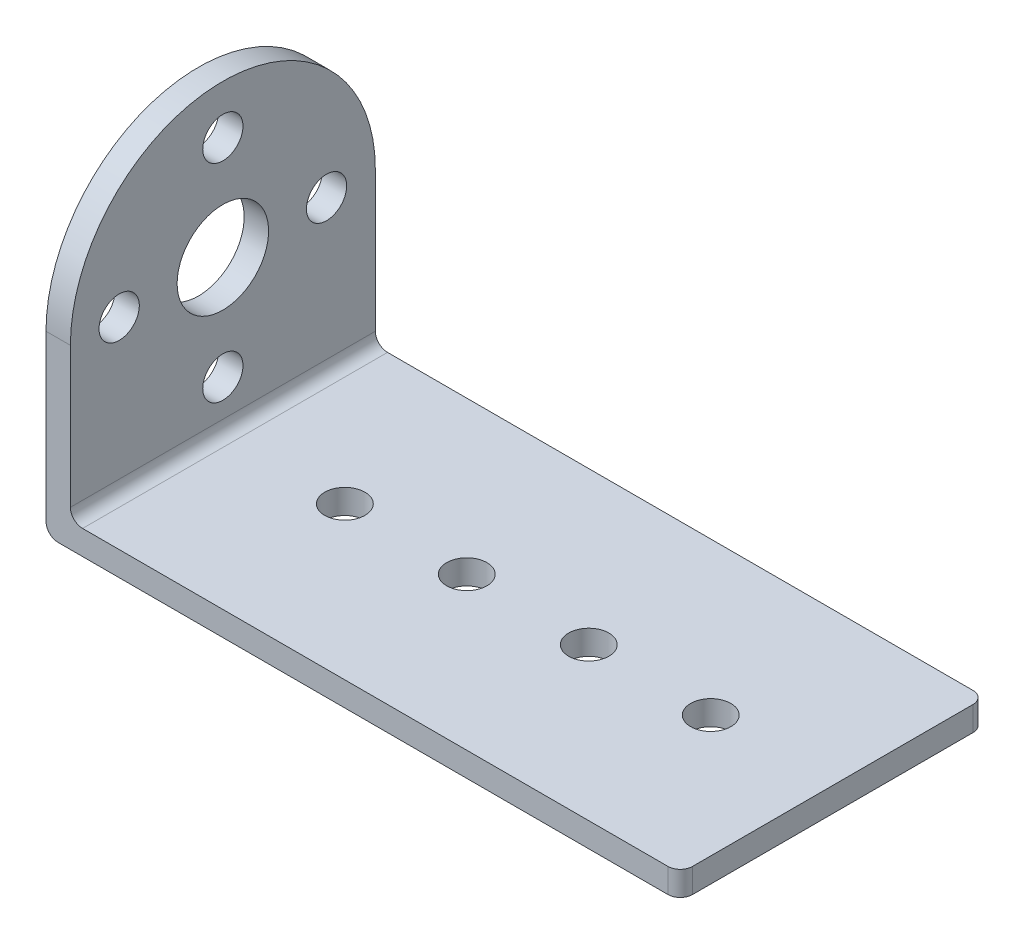
ISO-10303-21;
HEADER;
FILE_DESCRIPTION(('STEP AP214'),'2;1');
FILE_NAME('part.step','',(''),(''),'','','');
FILE_SCHEMA(('AUTOMOTIVE_DESIGN { 1 0 10303 214 1 1 1 1 }'));
ENDSEC;
DATA;
#1=APPLICATION_CONTEXT('core data for automotive mechanical design processes');
#2=APPLICATION_PROTOCOL_DEFINITION('international standard','automotive_design',2000,#1);
#3=PRODUCT_CONTEXT('',#1,'mechanical');
#4=PRODUCT('Part','Part','',(#3));
#5=PRODUCT_RELATED_PRODUCT_CATEGORY('part','',(#4));
#6=PRODUCT_DEFINITION_FORMATION('','',#4);
#7=PRODUCT_DEFINITION_CONTEXT('part definition',#1,'design');
#8=PRODUCT_DEFINITION('design','',#6,#7);
#9=PRODUCT_DEFINITION_SHAPE('','',#8);
#10=(LENGTH_UNIT() NAMED_UNIT(*) SI_UNIT(.MILLI.,.METRE.));
#11=(NAMED_UNIT(*) PLANE_ANGLE_UNIT() SI_UNIT($,.RADIAN.));
#12=(NAMED_UNIT(*) SI_UNIT($,.STERADIAN.) SOLID_ANGLE_UNIT());
#13=UNCERTAINTY_MEASURE_WITH_UNIT(LENGTH_MEASURE(1.E-05),#10,'distance_accuracy_value','');
#14=(GEOMETRIC_REPRESENTATION_CONTEXT(3) GLOBAL_UNCERTAINTY_ASSIGNED_CONTEXT((#13)) GLOBAL_UNIT_ASSIGNED_CONTEXT((#10,
#11,#12)) REPRESENTATION_CONTEXT('',''));
#15=CARTESIAN_POINT('',(0.,0.,0.));
#16=DIRECTION('',(0.,0.,1.));
#17=DIRECTION('',(1.,0.,0.));
#18=AXIS2_PLACEMENT_3D('',#15,#16,#17);
#19=CARTESIAN_POINT('',(0.,2.,0.));
#20=DIRECTION('',(1.,0.,0.));
#21=DIRECTION('',(0.,0.,-1.));
#22=AXIS2_PLACEMENT_3D('',#19,#20,#21);
#23=PLANE('',#22);
#24=CARTESIAN_POINT('',(0.,23.,-12.5));
#25=DIRECTION('',(-1.,0.,0.));
#26=DIRECTION('',(0.,0.,1.));
#27=AXIS2_PLACEMENT_3D('',#24,#25,#26);
#28=CIRCLE('',#27,1.65);
#29=CARTESIAN_POINT('',(0.,23.,-10.85));
#30=VERTEX_POINT('',#29);
#31=EDGE_CURVE('E301',#30,#30,#28,.T.);
#32=ORIENTED_EDGE('',*,*,#31,.F.);
#33=EDGE_LOOP('',(#32));
#34=FACE_BOUND('',#33,.T.);
#35=CARTESIAN_POINT('',(0.,6.,-12.5));
#36=DIRECTION('',(-1.,0.,0.));
#37=DIRECTION('',(0.,0.,1.));
#38=AXIS2_PLACEMENT_3D('',#35,#36,#37);
#39=CIRCLE('',#38,1.65);
#40=CARTESIAN_POINT('',(0.,6.,-10.85));
#41=VERTEX_POINT('',#40);
#42=EDGE_CURVE('E303',#41,#41,#39,.T.);
#43=ORIENTED_EDGE('',*,*,#42,.F.);
#44=EDGE_LOOP('',(#43));
#45=FACE_BOUND('',#44,.T.);
#46=CARTESIAN_POINT('',(0.,14.5,-4.));
#47=DIRECTION('',(-1.,0.,0.));
#48=DIRECTION('',(0.,0.,1.));
#49=AXIS2_PLACEMENT_3D('',#46,#47,#48);
#50=CIRCLE('',#49,1.65);
#51=CARTESIAN_POINT('',(0.,14.5,-2.35));
#52=VERTEX_POINT('',#51);
#53=EDGE_CURVE('E309',#52,#52,#50,.T.);
#54=ORIENTED_EDGE('',*,*,#53,.F.);
#55=EDGE_LOOP('',(#54));
#56=FACE_BOUND('',#55,.T.);
#57=CARTESIAN_POINT('',(0.,14.5,-21.));
#58=DIRECTION('',(-1.,0.,0.));
#59=DIRECTION('',(0.,0.,1.));
#60=AXIS2_PLACEMENT_3D('',#57,#58,#59);
#61=CIRCLE('',#60,1.65);
#62=CARTESIAN_POINT('',(0.,14.5,-19.35));
#63=VERTEX_POINT('',#62);
#64=EDGE_CURVE('E315',#63,#63,#61,.T.);
#65=ORIENTED_EDGE('',*,*,#64,.F.);
#66=EDGE_LOOP('',(#65));
#67=FACE_BOUND('',#66,.T.);
#68=CARTESIAN_POINT('',(0.,14.5,-12.5));
#69=DIRECTION('',(-1.,0.,0.));
#70=DIRECTION('',(0.,0.,1.));
#71=AXIS2_PLACEMENT_3D('',#68,#69,#70);
#72=CIRCLE('',#71,3.75);
#73=CARTESIAN_POINT('',(0.,14.5,-8.75));
#74=VERTEX_POINT('',#73);
#75=EDGE_CURVE('E321',#74,#74,#72,.T.);
#76=ORIENTED_EDGE('',*,*,#75,.F.);
#77=EDGE_LOOP('',(#76));
#78=FACE_BOUND('',#77,.T.);
#79=DIRECTION('',(0.,-1.,0.));
#80=VECTOR('',#79,1.);
#81=CARTESIAN_POINT('',(0.,2.,-25.));
#82=LINE('',#81,#80);
#83=CARTESIAN_POINT('',(0.,14.5,-25.));
#84=VERTEX_POINT('',#83);
#85=CARTESIAN_POINT('',(0.,1.,-25.));
#86=VERTEX_POINT('',#85);
#87=EDGE_CURVE('E130',#84,#86,#82,.T.);
#88=ORIENTED_EDGE('',*,*,#87,.T.);
#89=DIRECTION('',(0.,0.,1.));
#90=VECTOR('',#89,1.);
#91=CARTESIAN_POINT('',(0.,1.,0.));
#92=LINE('',#91,#90);
#93=CARTESIAN_POINT('',(0.,1.,0.));
#94=VERTEX_POINT('',#93);
#95=EDGE_CURVE('E128',#86,#94,#92,.T.);
#96=ORIENTED_EDGE('',*,*,#95,.T.);
#97=DIRECTION('',(0.,-1.,0.));
#98=VECTOR('',#97,1.);
#99=CARTESIAN_POINT('',(0.,2.,0.));
#100=LINE('',#99,#98);
#101=CARTESIAN_POINT('',(0.,14.5,0.));
#102=VERTEX_POINT('',#101);
#103=EDGE_CURVE('E116',#102,#94,#100,.T.);
#104=ORIENTED_EDGE('',*,*,#103,.F.);
#105=CARTESIAN_POINT('',(0.,14.5,-12.5));
#106=DIRECTION('',(-1.,0.,0.));
#107=DIRECTION('',(0.,0.,-1.));
#108=AXIS2_PLACEMENT_3D('',#105,#106,#107);
#109=CIRCLE('',#108,12.5);
#110=EDGE_CURVE('E127',#102,#84,#109,.T.);
#111=ORIENTED_EDGE('',*,*,#110,.T.);
#112=EDGE_LOOP('',(#88,#96,#104,#111));
#113=FACE_BOUND('',#112,.T.);
#114=ADVANCED_FACE('F34',(#34,#45,#56,#67,#78,#113),#23,.F.);
#115=CARTESIAN_POINT('',(0.,2.,0.));
#116=DIRECTION('',(0.,0.,-1.));
#117=DIRECTION('',(-1.,0.,0.));
#118=AXIS2_PLACEMENT_3D('',#115,#116,#117);
#119=PLANE('',#118);
#120=DIRECTION('',(1.,0.,0.));
#121=VECTOR('',#120,1.);
#122=CARTESIAN_POINT('',(0.,0.,0.));
#123=LINE('',#122,#121);
#124=CARTESIAN_POINT('',(1.,0.,0.));
#125=VERTEX_POINT('',#124);
#126=CARTESIAN_POINT('',(51.,0.,0.));
#127=VERTEX_POINT('',#126);
#128=EDGE_CURVE('E148',#125,#127,#123,.T.);
#129=ORIENTED_EDGE('',*,*,#128,.T.);
#130=DIRECTION('',(0.,-1.,0.));
#131=VECTOR('',#130,1.);
#132=CARTESIAN_POINT('',(51.,2.,0.));
#133=LINE('',#132,#131);
#134=CARTESIAN_POINT('',(51.,2.,0.));
#135=VERTEX_POINT('',#134);
#136=EDGE_CURVE('E185',#127,#135,#133,.F.);
#137=ORIENTED_EDGE('',*,*,#136,.T.);
#138=DIRECTION('',(1.,0.,0.));
#139=VECTOR('',#138,1.);
#140=CARTESIAN_POINT('',(0.,2.,0.));
#141=LINE('',#140,#139);
#142=CARTESIAN_POINT('',(3.,2.,0.));
#143=VERTEX_POINT('',#142);
#144=EDGE_CURVE('E149',#143,#135,#141,.T.);
#145=ORIENTED_EDGE('',*,*,#144,.F.);
#146=CARTESIAN_POINT('',(3.,3.,0.));
#147=DIRECTION('',(0.,0.,-1.));
#148=DIRECTION('',(-1.,0.,0.));
#149=AXIS2_PLACEMENT_3D('',#146,#147,#148);
#150=CIRCLE('',#149,1.);
#151=CARTESIAN_POINT('',(2.,3.,0.));
#152=VERTEX_POINT('',#151);
#153=EDGE_CURVE('E42',#143,#152,#150,.T.);
#154=ORIENTED_EDGE('',*,*,#153,.T.);
#155=DIRECTION('',(0.,-1.,0.));
#156=VECTOR('',#155,1.);
#157=CARTESIAN_POINT('',(2.,0.,0.));
#158=LINE('',#157,#156);
#159=CARTESIAN_POINT('',(2.,14.5,0.));
#160=VERTEX_POINT('',#159);
#161=EDGE_CURVE('E118',#160,#152,#158,.T.);
#162=ORIENTED_EDGE('',*,*,#161,.F.);
#163=DIRECTION('',(-1.,0.,0.));
#164=VECTOR('',#163,1.);
#165=CARTESIAN_POINT('',(2.,14.5,0.));
#166=LINE('',#165,#164);
#167=EDGE_CURVE('E112',#160,#102,#166,.T.);
#168=ORIENTED_EDGE('',*,*,#167,.T.);
#169=ORIENTED_EDGE('',*,*,#103,.T.);
#170=CARTESIAN_POINT('',(1.,1.,0.));
#171=DIRECTION('',(0.,0.,-1.));
#172=DIRECTION('',(-1.,0.,0.));
#173=AXIS2_PLACEMENT_3D('',#170,#171,#172);
#174=CIRCLE('',#173,1.);
#175=EDGE_CURVE('E57',#94,#125,#174,.F.);
#176=ORIENTED_EDGE('',*,*,#175,.T.);
#177=EDGE_LOOP('',(#129,#137,#145,#154,#162,#168,#169,#176));
#178=FACE_BOUND('',#177,.T.);
#179=ADVANCED_FACE('F115',(#178),#119,.F.);
#180=CARTESIAN_POINT('',(52.,2.,0.));
#181=DIRECTION('',(-1.,0.,0.));
#182=DIRECTION('',(0.,0.,1.));
#183=AXIS2_PLACEMENT_3D('',#180,#181,#182);
#184=PLANE('',#183);
#185=DIRECTION('',(0.,0.,-1.));
#186=VECTOR('',#185,1.);
#187=CARTESIAN_POINT('',(52.,2.,0.));
#188=LINE('',#187,#186);
#189=CARTESIAN_POINT('',(52.,2.,-1.));
#190=VERTEX_POINT('',#189);
#191=CARTESIAN_POINT('',(52.,2.,-24.));
#192=VERTEX_POINT('',#191);
#193=EDGE_CURVE('E152',#190,#192,#188,.T.);
#194=ORIENTED_EDGE('',*,*,#193,.F.);
#195=DIRECTION('',(0.,-1.,0.));
#196=VECTOR('',#195,1.);
#197=CARTESIAN_POINT('',(52.,2.,-1.));
#198=LINE('',#197,#196);
#199=CARTESIAN_POINT('',(52.,0.,-1.));
#200=VERTEX_POINT('',#199);
#201=EDGE_CURVE('E175',#190,#200,#198,.T.);
#202=ORIENTED_EDGE('',*,*,#201,.T.);
#203=DIRECTION('',(0.,0.,-1.));
#204=VECTOR('',#203,1.);
#205=CARTESIAN_POINT('',(52.,0.,0.));
#206=LINE('',#205,#204);
#207=CARTESIAN_POINT('',(52.,0.,-24.));
#208=VERTEX_POINT('',#207);
#209=EDGE_CURVE('E160',#200,#208,#206,.T.);
#210=ORIENTED_EDGE('',*,*,#209,.T.);
#211=DIRECTION('',(0.,-1.,0.));
#212=VECTOR('',#211,1.);
#213=CARTESIAN_POINT('',(52.,2.,-24.));
#214=LINE('',#213,#212);
#215=EDGE_CURVE('E173',#208,#192,#214,.F.);
#216=ORIENTED_EDGE('',*,*,#215,.T.);
#217=EDGE_LOOP('',(#194,#202,#210,#216));
#218=FACE_BOUND('',#217,.T.);
#219=ADVANCED_FACE('F226',(#218),#184,.F.);
#220=CARTESIAN_POINT('',(0.,2.,-25.));
#221=DIRECTION('',(0.,0.,1.));
#222=DIRECTION('',(1.,0.,0.));
#223=AXIS2_PLACEMENT_3D('',#220,#221,#222);
#224=PLANE('',#223);
#225=DIRECTION('',(-1.,0.,0.));
#226=VECTOR('',#225,1.);
#227=CARTESIAN_POINT('',(0.,2.,-25.));
#228=LINE('',#227,#226);
#229=CARTESIAN_POINT('',(51.,2.,-25.));
#230=VERTEX_POINT('',#229);
#231=CARTESIAN_POINT('',(3.,2.,-25.));
#232=VERTEX_POINT('',#231);
#233=EDGE_CURVE('E156',#230,#232,#228,.T.);
#234=ORIENTED_EDGE('',*,*,#233,.F.);
#235=DIRECTION('',(0.,-1.,0.));
#236=VECTOR('',#235,1.);
#237=CARTESIAN_POINT('',(51.,2.,-25.));
#238=LINE('',#237,#236);
#239=CARTESIAN_POINT('',(51.,0.,-25.));
#240=VERTEX_POINT('',#239);
#241=EDGE_CURVE('E188',#230,#240,#238,.T.);
#242=ORIENTED_EDGE('',*,*,#241,.T.);
#243=DIRECTION('',(-1.,0.,0.));
#244=VECTOR('',#243,1.);
#245=CARTESIAN_POINT('',(0.,0.,-25.));
#246=LINE('',#245,#244);
#247=CARTESIAN_POINT('',(1.,0.,-25.));
#248=VERTEX_POINT('',#247);
#249=EDGE_CURVE('E153',#240,#248,#246,.T.);
#250=ORIENTED_EDGE('',*,*,#249,.T.);
#251=CARTESIAN_POINT('',(1.,1.,-25.));
#252=DIRECTION('',(0.,0.,1.));
#253=DIRECTION('',(1.,0.,0.));
#254=AXIS2_PLACEMENT_3D('',#251,#252,#253);
#255=CIRCLE('',#254,1.);
#256=EDGE_CURVE('E49',#248,#86,#255,.F.);
#257=ORIENTED_EDGE('',*,*,#256,.T.);
#258=ORIENTED_EDGE('',*,*,#87,.F.);
#259=DIRECTION('',(-1.,0.,0.));
#260=VECTOR('',#259,1.);
#261=CARTESIAN_POINT('',(2.,14.5,-25.));
#262=LINE('',#261,#260);
#263=CARTESIAN_POINT('',(2.,14.5,-25.));
#264=VERTEX_POINT('',#263);
#265=EDGE_CURVE('E123',#264,#84,#262,.T.);
#266=ORIENTED_EDGE('',*,*,#265,.F.);
#267=DIRECTION('',(0.,1.,0.));
#268=VECTOR('',#267,1.);
#269=CARTESIAN_POINT('',(2.,0.,-25.));
#270=LINE('',#269,#268);
#271=CARTESIAN_POINT('',(2.,3.,-25.));
#272=VERTEX_POINT('',#271);
#273=EDGE_CURVE('E138',#272,#264,#270,.T.);
#274=ORIENTED_EDGE('',*,*,#273,.F.);
#275=CARTESIAN_POINT('',(3.,3.,-25.));
#276=DIRECTION('',(0.,0.,1.));
#277=DIRECTION('',(1.,0.,0.));
#278=AXIS2_PLACEMENT_3D('',#275,#276,#277);
#279=CIRCLE('',#278,1.);
#280=EDGE_CURVE('E11',#272,#232,#279,.T.);
#281=ORIENTED_EDGE('',*,*,#280,.T.);
#282=EDGE_LOOP('',(#234,#242,#250,#257,#258,#266,#274,#281));
#283=FACE_BOUND('',#282,.T.);
#284=ADVANCED_FACE('F201',(#283),#224,.F.);
#285=CARTESIAN_POINT('',(0.,2.,0.));
#286=DIRECTION('',(0.,-1.,0.));
#287=DIRECTION('',(0.,0.,-1.));
#288=AXIS2_PLACEMENT_3D('',#285,#286,#287);
#289=PLANE('',#288);
#290=CARTESIAN_POINT('',(42.,2.,-12.5));
#291=DIRECTION('',(0.,1.,0.));
#292=DIRECTION('',(0.,0.,1.));
#293=AXIS2_PLACEMENT_3D('',#290,#291,#292);
#294=CIRCLE('',#293,1.65);
#295=CARTESIAN_POINT('',(42.,2.,-10.85));
#296=VERTEX_POINT('',#295);
#297=EDGE_CURVE('E327',#296,#296,#294,.T.);
#298=ORIENTED_EDGE('',*,*,#297,.F.);
#299=EDGE_LOOP('',(#298));
#300=FACE_BOUND('',#299,.T.);
#301=CARTESIAN_POINT('',(32.,2.,-12.5));
#302=DIRECTION('',(0.,1.,0.));
#303=DIRECTION('',(0.,0.,1.));
#304=AXIS2_PLACEMENT_3D('',#301,#302,#303);
#305=CIRCLE('',#304,1.65);
#306=CARTESIAN_POINT('',(32.,2.,-10.85));
#307=VERTEX_POINT('',#306);
#308=EDGE_CURVE('E333',#307,#307,#305,.T.);
#309=ORIENTED_EDGE('',*,*,#308,.F.);
#310=EDGE_LOOP('',(#309));
#311=FACE_BOUND('',#310,.T.);
#312=CARTESIAN_POINT('',(22.,2.,-12.5));
#313=DIRECTION('',(0.,1.,0.));
#314=DIRECTION('',(0.,0.,1.));
#315=AXIS2_PLACEMENT_3D('',#312,#313,#314);
#316=CIRCLE('',#315,1.65);
#317=CARTESIAN_POINT('',(22.,2.,-10.85));
#318=VERTEX_POINT('',#317);
#319=EDGE_CURVE('E339',#318,#318,#316,.T.);
#320=ORIENTED_EDGE('',*,*,#319,.F.);
#321=EDGE_LOOP('',(#320));
#322=FACE_BOUND('',#321,.T.);
#323=CARTESIAN_POINT('',(12.,2.,-12.5));
#324=DIRECTION('',(0.,1.,0.));
#325=DIRECTION('',(0.,0.,1.));
#326=AXIS2_PLACEMENT_3D('',#323,#324,#325);
#327=CIRCLE('',#326,1.65);
#328=CARTESIAN_POINT('',(12.,2.,-10.85));
#329=VERTEX_POINT('',#328);
#330=EDGE_CURVE('E141',#329,#329,#327,.T.);
#331=ORIENTED_EDGE('',*,*,#330,.F.);
#332=EDGE_LOOP('',(#331));
#333=FACE_BOUND('',#332,.T.);
#334=ORIENTED_EDGE('',*,*,#233,.T.);
#335=DIRECTION('',(0.,0.,1.));
#336=VECTOR('',#335,1.);
#337=CARTESIAN_POINT('',(3.,2.,0.));
#338=LINE('',#337,#336);
#339=EDGE_CURVE('E168',#232,#143,#338,.T.);
#340=ORIENTED_EDGE('',*,*,#339,.T.);
#341=ORIENTED_EDGE('',*,*,#144,.T.);
#342=CARTESIAN_POINT('',(51.,2.,-1.));
#343=DIRECTION('',(0.,-1.,0.));
#344=DIRECTION('',(0.,0.,-1.));
#345=AXIS2_PLACEMENT_3D('',#342,#343,#344);
#346=CIRCLE('',#345,1.);
#347=EDGE_CURVE('E166',#135,#190,#346,.F.);
#348=ORIENTED_EDGE('',*,*,#347,.T.);
#349=ORIENTED_EDGE('',*,*,#193,.T.);
#350=CARTESIAN_POINT('',(51.,2.,-24.));
#351=DIRECTION('',(0.,-1.,0.));
#352=DIRECTION('',(0.,0.,-1.));
#353=AXIS2_PLACEMENT_3D('',#350,#351,#352);
#354=CIRCLE('',#353,1.);
#355=EDGE_CURVE('E129',#192,#230,#354,.F.);
#356=ORIENTED_EDGE('',*,*,#355,.T.);
#357=EDGE_LOOP('',(#334,#340,#341,#348,#349,#356));
#358=FACE_BOUND('',#357,.T.);
#359=ADVANCED_FACE('F204',(#300,#311,#322,#333,#358),#289,.F.);
#360=CARTESIAN_POINT('',(0.,0.,0.));
#361=DIRECTION('',(0.,-1.,0.));
#362=DIRECTION('',(0.,0.,-1.));
#363=AXIS2_PLACEMENT_3D('',#360,#361,#362);
#364=PLANE('',#363);
#365=CARTESIAN_POINT('',(42.,0.,-12.5));
#366=DIRECTION('',(0.,1.,0.));
#367=DIRECTION('',(0.,0.,1.));
#368=AXIS2_PLACEMENT_3D('',#365,#366,#367);
#369=CIRCLE('',#368,1.65);
#370=CARTESIAN_POINT('',(42.,0.,-10.85));
#371=VERTEX_POINT('',#370);
#372=EDGE_CURVE('E330',#371,#371,#369,.T.);
#373=ORIENTED_EDGE('',*,*,#372,.T.);
#374=EDGE_LOOP('',(#373));
#375=FACE_BOUND('',#374,.T.);
#376=CARTESIAN_POINT('',(32.,0.,-12.5));
#377=DIRECTION('',(0.,1.,0.));
#378=DIRECTION('',(0.,0.,1.));
#379=AXIS2_PLACEMENT_3D('',#376,#377,#378);
#380=CIRCLE('',#379,1.65);
#381=CARTESIAN_POINT('',(32.,0.,-10.85));
#382=VERTEX_POINT('',#381);
#383=EDGE_CURVE('E336',#382,#382,#380,.T.);
#384=ORIENTED_EDGE('',*,*,#383,.T.);
#385=EDGE_LOOP('',(#384));
#386=FACE_BOUND('',#385,.T.);
#387=CARTESIAN_POINT('',(22.,0.,-12.5));
#388=DIRECTION('',(0.,1.,0.));
#389=DIRECTION('',(0.,0.,1.));
#390=AXIS2_PLACEMENT_3D('',#387,#388,#389);
#391=CIRCLE('',#390,1.65);
#392=CARTESIAN_POINT('',(22.,0.,-10.85));
#393=VERTEX_POINT('',#392);
#394=EDGE_CURVE('E342',#393,#393,#391,.T.);
#395=ORIENTED_EDGE('',*,*,#394,.T.);
#396=EDGE_LOOP('',(#395));
#397=FACE_BOUND('',#396,.T.);
#398=CARTESIAN_POINT('',(12.,0.,-12.5));
#399=DIRECTION('',(0.,1.,0.));
#400=DIRECTION('',(0.,0.,1.));
#401=AXIS2_PLACEMENT_3D('',#398,#399,#400);
#402=CIRCLE('',#401,1.65);
#403=CARTESIAN_POINT('',(12.,0.,-10.85));
#404=VERTEX_POINT('',#403);
#405=EDGE_CURVE('E136',#404,#404,#402,.T.);
#406=ORIENTED_EDGE('',*,*,#405,.T.);
#407=EDGE_LOOP('',(#406));
#408=FACE_BOUND('',#407,.T.);
#409=ORIENTED_EDGE('',*,*,#209,.F.);
#410=CARTESIAN_POINT('',(51.,0.,-1.));
#411=DIRECTION('',(0.,-1.,0.));
#412=DIRECTION('',(0.,0.,-1.));
#413=AXIS2_PLACEMENT_3D('',#410,#411,#412);
#414=CIRCLE('',#413,1.);
#415=EDGE_CURVE('E182',#200,#127,#414,.T.);
#416=ORIENTED_EDGE('',*,*,#415,.T.);
#417=ORIENTED_EDGE('',*,*,#128,.F.);
#418=DIRECTION('',(0.,0.,1.));
#419=VECTOR('',#418,1.);
#420=CARTESIAN_POINT('',(1.,0.,-25.));
#421=LINE('',#420,#419);
#422=EDGE_CURVE('E178',#125,#248,#421,.F.);
#423=ORIENTED_EDGE('',*,*,#422,.T.);
#424=ORIENTED_EDGE('',*,*,#249,.F.);
#425=CARTESIAN_POINT('',(51.,0.,-24.));
#426=DIRECTION('',(0.,-1.,0.));
#427=DIRECTION('',(0.,0.,-1.));
#428=AXIS2_PLACEMENT_3D('',#425,#426,#427);
#429=CIRCLE('',#428,1.);
#430=EDGE_CURVE('E180',#240,#208,#429,.T.);
#431=ORIENTED_EDGE('',*,*,#430,.T.);
#432=EDGE_LOOP('',(#409,#416,#417,#423,#424,#431));
#433=FACE_BOUND('',#432,.T.);
#434=ADVANCED_FACE('F213',(#375,#386,#397,#408,#433),#364,.T.);
#435=CARTESIAN_POINT('',(2.,0.,0.));
#436=DIRECTION('',(1.,0.,0.));
#437=DIRECTION('',(0.,0.,-1.));
#438=AXIS2_PLACEMENT_3D('',#435,#436,#437);
#439=PLANE('',#438);
#440=CARTESIAN_POINT('',(2.,23.,-12.5));
#441=DIRECTION('',(-1.,0.,0.));
#442=DIRECTION('',(0.,0.,1.));
#443=AXIS2_PLACEMENT_3D('',#440,#441,#442);
#444=CIRCLE('',#443,1.65);
#445=CARTESIAN_POINT('',(2.,23.,-10.85));
#446=VERTEX_POINT('',#445);
#447=EDGE_CURVE('E299',#446,#446,#444,.T.);
#448=ORIENTED_EDGE('',*,*,#447,.T.);
#449=EDGE_LOOP('',(#448));
#450=FACE_BOUND('',#449,.T.);
#451=CARTESIAN_POINT('',(2.,6.,-12.5));
#452=DIRECTION('',(-1.,0.,0.));
#453=DIRECTION('',(0.,0.,1.));
#454=AXIS2_PLACEMENT_3D('',#451,#452,#453);
#455=CIRCLE('',#454,1.65);
#456=CARTESIAN_POINT('',(2.,6.,-10.85));
#457=VERTEX_POINT('',#456);
#458=EDGE_CURVE('E306',#457,#457,#455,.T.);
#459=ORIENTED_EDGE('',*,*,#458,.T.);
#460=EDGE_LOOP('',(#459));
#461=FACE_BOUND('',#460,.T.);
#462=CARTESIAN_POINT('',(2.,14.5,-4.));
#463=DIRECTION('',(-1.,0.,0.));
#464=DIRECTION('',(0.,0.,1.));
#465=AXIS2_PLACEMENT_3D('',#462,#463,#464);
#466=CIRCLE('',#465,1.65);
#467=CARTESIAN_POINT('',(2.,14.5,-2.35));
#468=VERTEX_POINT('',#467);
#469=EDGE_CURVE('E312',#468,#468,#466,.T.);
#470=ORIENTED_EDGE('',*,*,#469,.T.);
#471=EDGE_LOOP('',(#470));
#472=FACE_BOUND('',#471,.T.);
#473=CARTESIAN_POINT('',(2.,14.5,-21.));
#474=DIRECTION('',(-1.,0.,0.));
#475=DIRECTION('',(0.,0.,1.));
#476=AXIS2_PLACEMENT_3D('',#473,#474,#475);
#477=CIRCLE('',#476,1.65);
#478=CARTESIAN_POINT('',(2.,14.5,-19.35));
#479=VERTEX_POINT('',#478);
#480=EDGE_CURVE('E318',#479,#479,#477,.T.);
#481=ORIENTED_EDGE('',*,*,#480,.T.);
#482=EDGE_LOOP('',(#481));
#483=FACE_BOUND('',#482,.T.);
#484=CARTESIAN_POINT('',(2.,14.5,-12.5));
#485=DIRECTION('',(-1.,0.,0.));
#486=DIRECTION('',(0.,0.,1.));
#487=AXIS2_PLACEMENT_3D('',#484,#485,#486);
#488=CIRCLE('',#487,3.75);
#489=CARTESIAN_POINT('',(2.,14.5,-8.75));
#490=VERTEX_POINT('',#489);
#491=EDGE_CURVE('E324',#490,#490,#488,.T.);
#492=ORIENTED_EDGE('',*,*,#491,.T.);
#493=EDGE_LOOP('',(#492));
#494=FACE_BOUND('',#493,.T.);
#495=ORIENTED_EDGE('',*,*,#161,.T.);
#496=DIRECTION('',(0.,0.,1.));
#497=VECTOR('',#496,1.);
#498=CARTESIAN_POINT('',(2.,3.,0.));
#499=LINE('',#498,#497);
#500=EDGE_CURVE('E171',#152,#272,#499,.F.);
#501=ORIENTED_EDGE('',*,*,#500,.T.);
#502=ORIENTED_EDGE('',*,*,#273,.T.);
#503=CARTESIAN_POINT('',(2.,14.5,-12.5));
#504=DIRECTION('',(-1.,0.,0.));
#505=DIRECTION('',(0.,0.,-1.));
#506=AXIS2_PLACEMENT_3D('',#503,#504,#505);
#507=CIRCLE('',#506,12.5);
#508=EDGE_CURVE('E135',#160,#264,#507,.T.);
#509=ORIENTED_EDGE('',*,*,#508,.F.);
#510=EDGE_LOOP('',(#495,#501,#502,#509));
#511=FACE_BOUND('',#510,.T.);
#512=ADVANCED_FACE('F196',(#450,#461,#472,#483,#494,#511),#439,.T.);
#513=CARTESIAN_POINT('',(2.,14.5,-12.5));
#514=DIRECTION('',(-1.,0.,0.));
#515=DIRECTION('',(0.,0.,1.));
#516=AXIS2_PLACEMENT_3D('',#513,#514,#515);
#517=CYLINDRICAL_SURFACE('',#516,12.5);
#518=ORIENTED_EDGE('',*,*,#110,.F.);
#519=ORIENTED_EDGE('',*,*,#167,.F.);
#520=ORIENTED_EDGE('',*,*,#508,.T.);
#521=ORIENTED_EDGE('',*,*,#265,.T.);
#522=EDGE_LOOP('',(#518,#519,#520,#521));
#523=FACE_BOUND('',#522,.T.);
#524=ADVANCED_FACE('F133',(#523),#517,.T.);
#525=CARTESIAN_POINT('',(12.,0.,-12.5));
#526=DIRECTION('',(0.,1.,0.));
#527=DIRECTION('',(0.,0.,1.));
#528=AXIS2_PLACEMENT_3D('',#525,#526,#527);
#529=CYLINDRICAL_SURFACE('',#528,1.65);
#530=ORIENTED_EDGE('',*,*,#405,.F.);
#531=EDGE_LOOP('',(#530));
#532=FACE_BOUND('',#531,.T.);
#533=ORIENTED_EDGE('',*,*,#330,.T.);
#534=EDGE_LOOP('',(#533));
#535=FACE_BOUND('',#534,.T.);
#536=ADVANCED_FACE('F260',(#532,#535),#529,.F.);
#537=CARTESIAN_POINT('',(22.,0.,-12.5));
#538=DIRECTION('',(0.,1.,0.));
#539=DIRECTION('',(0.,0.,1.));
#540=AXIS2_PLACEMENT_3D('',#537,#538,#539);
#541=CYLINDRICAL_SURFACE('',#540,1.65);
#542=ORIENTED_EDGE('',*,*,#394,.F.);
#543=EDGE_LOOP('',(#542));
#544=FACE_BOUND('',#543,.T.);
#545=ORIENTED_EDGE('',*,*,#319,.T.);
#546=EDGE_LOOP('',(#545));
#547=FACE_BOUND('',#546,.T.);
#548=ADVANCED_FACE('F263',(#544,#547),#541,.F.);
#549=CARTESIAN_POINT('',(32.,0.,-12.5));
#550=DIRECTION('',(0.,1.,0.));
#551=DIRECTION('',(0.,0.,1.));
#552=AXIS2_PLACEMENT_3D('',#549,#550,#551);
#553=CYLINDRICAL_SURFACE('',#552,1.65);
#554=ORIENTED_EDGE('',*,*,#383,.F.);
#555=EDGE_LOOP('',(#554));
#556=FACE_BOUND('',#555,.T.);
#557=ORIENTED_EDGE('',*,*,#308,.T.);
#558=EDGE_LOOP('',(#557));
#559=FACE_BOUND('',#558,.T.);
#560=ADVANCED_FACE('F267',(#556,#559),#553,.F.);
#561=CARTESIAN_POINT('',(42.,0.,-12.5));
#562=DIRECTION('',(0.,1.,0.));
#563=DIRECTION('',(0.,0.,1.));
#564=AXIS2_PLACEMENT_3D('',#561,#562,#563);
#565=CYLINDRICAL_SURFACE('',#564,1.65);
#566=ORIENTED_EDGE('',*,*,#372,.F.);
#567=EDGE_LOOP('',(#566));
#568=FACE_BOUND('',#567,.T.);
#569=ORIENTED_EDGE('',*,*,#297,.T.);
#570=EDGE_LOOP('',(#569));
#571=FACE_BOUND('',#570,.T.);
#572=ADVANCED_FACE('F271',(#568,#571),#565,.F.);
#573=CARTESIAN_POINT('',(2.,14.5,-12.5));
#574=DIRECTION('',(-1.,0.,0.));
#575=DIRECTION('',(0.,0.,1.));
#576=AXIS2_PLACEMENT_3D('',#573,#574,#575);
#577=CYLINDRICAL_SURFACE('',#576,3.75);
#578=ORIENTED_EDGE('',*,*,#491,.F.);
#579=EDGE_LOOP('',(#578));
#580=FACE_BOUND('',#579,.T.);
#581=ORIENTED_EDGE('',*,*,#75,.T.);
#582=EDGE_LOOP('',(#581));
#583=FACE_BOUND('',#582,.T.);
#584=ADVANCED_FACE('F275',(#580,#583),#577,.F.);
#585=CARTESIAN_POINT('',(2.,14.5,-21.));
#586=DIRECTION('',(-1.,0.,0.));
#587=DIRECTION('',(0.,0.,1.));
#588=AXIS2_PLACEMENT_3D('',#585,#586,#587);
#589=CYLINDRICAL_SURFACE('',#588,1.65);
#590=ORIENTED_EDGE('',*,*,#480,.F.);
#591=EDGE_LOOP('',(#590));
#592=FACE_BOUND('',#591,.T.);
#593=ORIENTED_EDGE('',*,*,#64,.T.);
#594=EDGE_LOOP('',(#593));
#595=FACE_BOUND('',#594,.T.);
#596=ADVANCED_FACE('F279',(#592,#595),#589,.F.);
#597=CARTESIAN_POINT('',(2.,14.5,-4.));
#598=DIRECTION('',(-1.,0.,0.));
#599=DIRECTION('',(0.,0.,1.));
#600=AXIS2_PLACEMENT_3D('',#597,#598,#599);
#601=CYLINDRICAL_SURFACE('',#600,1.65);
#602=ORIENTED_EDGE('',*,*,#469,.F.);
#603=EDGE_LOOP('',(#602));
#604=FACE_BOUND('',#603,.T.);
#605=ORIENTED_EDGE('',*,*,#53,.T.);
#606=EDGE_LOOP('',(#605));
#607=FACE_BOUND('',#606,.T.);
#608=ADVANCED_FACE('F283',(#604,#607),#601,.F.);
#609=CARTESIAN_POINT('',(2.,6.,-12.5));
#610=DIRECTION('',(-1.,0.,0.));
#611=DIRECTION('',(0.,0.,1.));
#612=AXIS2_PLACEMENT_3D('',#609,#610,#611);
#613=CYLINDRICAL_SURFACE('',#612,1.65);
#614=ORIENTED_EDGE('',*,*,#458,.F.);
#615=EDGE_LOOP('',(#614));
#616=FACE_BOUND('',#615,.T.);
#617=ORIENTED_EDGE('',*,*,#42,.T.);
#618=EDGE_LOOP('',(#617));
#619=FACE_BOUND('',#618,.T.);
#620=ADVANCED_FACE('F287',(#616,#619),#613,.F.);
#621=CARTESIAN_POINT('',(2.,23.,-12.5));
#622=DIRECTION('',(-1.,0.,0.));
#623=DIRECTION('',(0.,0.,1.));
#624=AXIS2_PLACEMENT_3D('',#621,#622,#623);
#625=CYLINDRICAL_SURFACE('',#624,1.65);
#626=ORIENTED_EDGE('',*,*,#447,.F.);
#627=EDGE_LOOP('',(#626));
#628=FACE_BOUND('',#627,.T.);
#629=ORIENTED_EDGE('',*,*,#31,.T.);
#630=EDGE_LOOP('',(#629));
#631=FACE_BOUND('',#630,.T.);
#632=ADVANCED_FACE('F234',(#628,#631),#625,.F.);
#633=CARTESIAN_POINT('',(3.,3.,0.));
#634=DIRECTION('',(0.,0.,1.));
#635=DIRECTION('',(1.,0.,0.));
#636=AXIS2_PLACEMENT_3D('',#633,#634,#635);
#637=CYLINDRICAL_SURFACE('',#636,1.);
#638=ORIENTED_EDGE('',*,*,#280,.F.);
#639=ORIENTED_EDGE('',*,*,#500,.F.);
#640=ORIENTED_EDGE('',*,*,#153,.F.);
#641=ORIENTED_EDGE('',*,*,#339,.F.);
#642=EDGE_LOOP('',(#638,#639,#640,#641));
#643=FACE_BOUND('',#642,.T.);
#644=ADVANCED_FACE('F199',(#643),#637,.F.);
#645=CARTESIAN_POINT('',(51.,2.,-1.));
#646=DIRECTION('',(0.,-1.,0.));
#647=DIRECTION('',(0.,0.,-1.));
#648=AXIS2_PLACEMENT_3D('',#645,#646,#647);
#649=CYLINDRICAL_SURFACE('',#648,1.);
#650=ORIENTED_EDGE('',*,*,#347,.F.);
#651=ORIENTED_EDGE('',*,*,#136,.F.);
#652=ORIENTED_EDGE('',*,*,#415,.F.);
#653=ORIENTED_EDGE('',*,*,#201,.F.);
#654=EDGE_LOOP('',(#650,#651,#652,#653));
#655=FACE_BOUND('',#654,.T.);
#656=ADVANCED_FACE('F219',(#655),#649,.T.);
#657=CARTESIAN_POINT('',(51.,2.,-24.));
#658=DIRECTION('',(0.,-1.,0.));
#659=DIRECTION('',(0.,0.,-1.));
#660=AXIS2_PLACEMENT_3D('',#657,#658,#659);
#661=CYLINDRICAL_SURFACE('',#660,1.);
#662=ORIENTED_EDGE('',*,*,#355,.F.);
#663=ORIENTED_EDGE('',*,*,#215,.F.);
#664=ORIENTED_EDGE('',*,*,#430,.F.);
#665=ORIENTED_EDGE('',*,*,#241,.F.);
#666=EDGE_LOOP('',(#662,#663,#664,#665));
#667=FACE_BOUND('',#666,.T.);
#668=ADVANCED_FACE('F209',(#667),#661,.T.);
#669=CARTESIAN_POINT('',(1.,1.,0.));
#670=DIRECTION('',(0.,0.,-1.));
#671=DIRECTION('',(-1.,0.,0.));
#672=AXIS2_PLACEMENT_3D('',#669,#670,#671);
#673=CYLINDRICAL_SURFACE('',#672,1.);
#674=ORIENTED_EDGE('',*,*,#256,.F.);
#675=ORIENTED_EDGE('',*,*,#422,.F.);
#676=ORIENTED_EDGE('',*,*,#175,.F.);
#677=ORIENTED_EDGE('',*,*,#95,.F.);
#678=EDGE_LOOP('',(#674,#675,#676,#677));
#679=FACE_BOUND('',#678,.T.);
#680=ADVANCED_FACE('F36',(#679),#673,.T.);
#681=CLOSED_SHELL('',(#114,#179,#219,#284,#359,#434,#512,#524,#536,#548,#560,#572,#584,#596,
#608,#620,#632,#644,#656,#668,#680));
#682=MANIFOLD_SOLID_BREP('B2',#681);
#683=ADVANCED_BREP_SHAPE_REPRESENTATION('',(#18,#682),#14);
#684=SHAPE_DEFINITION_REPRESENTATION(#9,#683);
ENDSEC;
END-ISO-10303-21;
